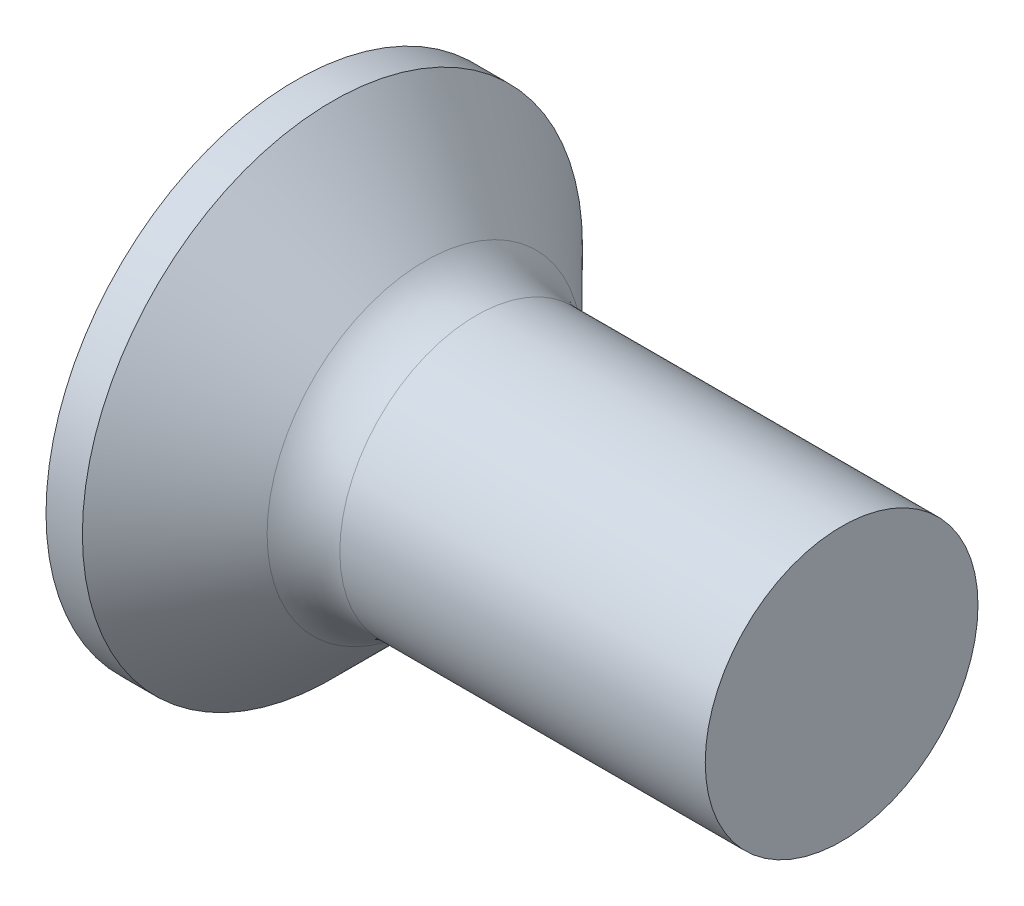
ISO-10303-21;
HEADER;
FILE_DESCRIPTION(('STEP AP214'),'2;1');
FILE_NAME('part.step','',(''),(''),'','','');
FILE_SCHEMA(('AUTOMOTIVE_DESIGN { 1 0 10303 214 1 1 1 1 }'));
ENDSEC;
DATA;
#1=APPLICATION_CONTEXT('core data for automotive mechanical design processes');
#2=APPLICATION_PROTOCOL_DEFINITION('international standard','automotive_design',2000,#1);
#3=PRODUCT_CONTEXT('',#1,'mechanical');
#4=PRODUCT('Part','Part','',(#3));
#5=PRODUCT_RELATED_PRODUCT_CATEGORY('part','',(#4));
#6=PRODUCT_DEFINITION_FORMATION('','',#4);
#7=PRODUCT_DEFINITION_CONTEXT('part definition',#1,'design');
#8=PRODUCT_DEFINITION('design','',#6,#7);
#9=PRODUCT_DEFINITION_SHAPE('','',#8);
#10=(LENGTH_UNIT() NAMED_UNIT(*) SI_UNIT(.MILLI.,.METRE.));
#11=(NAMED_UNIT(*) PLANE_ANGLE_UNIT() SI_UNIT($,.RADIAN.));
#12=(NAMED_UNIT(*) SI_UNIT($,.STERADIAN.) SOLID_ANGLE_UNIT());
#13=UNCERTAINTY_MEASURE_WITH_UNIT(LENGTH_MEASURE(1.E-05),#10,'distance_accuracy_value','');
#14=(GEOMETRIC_REPRESENTATION_CONTEXT(3) GLOBAL_UNCERTAINTY_ASSIGNED_CONTEXT((#13)) GLOBAL_UNIT_ASSIGNED_CONTEXT((#10,
#11,#12)) REPRESENTATION_CONTEXT('',''));
#15=CARTESIAN_POINT('',(0.,0.,0.));
#16=DIRECTION('',(0.,0.,1.));
#17=DIRECTION('',(1.,0.,0.));
#18=AXIS2_PLACEMENT_3D('',#15,#16,#17);
#19=CARTESIAN_POINT('',(2.01,-0.497851135403458,0.37));
#20=DIRECTION('',(0.,0.,-1.));
#21=DIRECTION('',(0.,1.,0.));
#22=AXIS2_PLACEMENT_3D('',#19,#20,#21);
#23=PLANE('',#22);
#24=DIRECTION('',(0.,-1.,0.));
#25=VECTOR('',#24,1.);
#26=CARTESIAN_POINT('',(0.,1.5,0.37));
#27=LINE('',#26,#25);
#28=CARTESIAN_POINT('',(0.,-0.590157547916263,0.37));
#29=VERTEX_POINT('',#28);
#30=CARTESIAN_POINT('',(0.,-1.5,0.37));
#31=VERTEX_POINT('',#30);
#32=EDGE_CURVE('E458',#29,#31,#27,.T.);
#33=ORIENTED_EDGE('',*,*,#32,.F.);
#34=CARTESIAN_POINT('',(-1.01053649691082,-0.672102030072118,0.37));
#35=CARTESIAN_POINT('',(-0.79970605871103,-0.655267098883947,0.37));
#36=CARTESIAN_POINT('',(-0.588886212503304,-0.638297110572311,0.37));
#37=CARTESIAN_POINT('',(-0.167272662529611,-0.603984130519828,0.37));
#38=CARTESIAN_POINT('',(0.0435210406290472,-0.586641131324258,0.37));
#39=CARTESIAN_POINT('',(0.465068838244709,-0.551479911667385,0.37));
#40=CARTESIAN_POINT('',(0.67582293271526,-0.533661691368909,0.37));
#41=CARTESIAN_POINT('',(1.09727362083221,-0.497387538872971,0.37));
#42=CARTESIAN_POINT('',(1.30797021521736,-0.478931615299089,0.37));
#43=CARTESIAN_POINT('',(1.67418894757201,-0.446067164121906,0.37));
#44=CARTESIAN_POINT('',(1.82972932585734,-0.431862501028414,0.37));
#45=CARTESIAN_POINT('',(2.14074770359484,-0.40279770973988,0.37));
#46=CARTESIAN_POINT('',(2.29622570356215,-0.38793758707517,0.37));
#47=CARTESIAN_POINT('',(2.60710169348415,-0.357305117937677,0.37));
#48=CARTESIAN_POINT('',(2.76249967840253,-0.34153271979064,0.37));
#49=CARTESIAN_POINT('',(2.99549070742189,-0.316847908281595,0.37));
#50=CARTESIAN_POINT('',(3.07313791118864,-0.308448465897182,0.37));
#51=CARTESIAN_POINT('',(3.22838341575769,-0.29120225104834,0.37));
#52=CARTESIAN_POINT('',(3.30598171599396,-0.282355473499083,0.37));
#53=CARTESIAN_POINT('',(3.38354828463398,-0.273232461289951,0.37));
#54=B_SPLINE_CURVE_WITH_KNOTS('',3,(#34,#35,#36,#37,#38,#39,#40,#41,#42,#43,#44,#45,#46,#47,#48,
#49,#50,#51,#52,#53),.UNSPECIFIED.,.F.,.F.,(4,2,2,2,2,2,2,2,2,4),(0.,0.634504777554397,
1.26902224766093,1.90353950036111,2.53804817592041,3.00661008438666,3.47516804019383,
3.94375256268972,4.17805198331268,4.41235406779909),.UNSPECIFIED.);
#55=CARTESIAN_POINT('',(2.01,-0.415013252800437,0.37));
#56=VERTEX_POINT('',#55);
#57=EDGE_CURVE('E214',#29,#56,#54,.T.);
#58=ORIENTED_EDGE('',*,*,#57,.T.);
#59=DIRECTION('',(0.,-1.,0.));
#60=VECTOR('',#59,1.);
#61=CARTESIAN_POINT('',(2.01,0.497851135403459,0.37));
#62=LINE('',#61,#60);
#63=CARTESIAN_POINT('',(2.01,-0.497851135403458,0.37));
#64=VERTEX_POINT('',#63);
#65=EDGE_CURVE('E367',#56,#64,#62,.T.);
#66=ORIENTED_EDGE('',*,*,#65,.T.);
#67=DIRECTION('',(0.894934391398442,0.446197753347436,0.));
#68=VECTOR('',#67,1.);
#69=CARTESIAN_POINT('',(0.,-1.5,0.37));
#70=LINE('',#69,#68);
#71=EDGE_CURVE('E466',#31,#64,#70,.T.);
#72=ORIENTED_EDGE('',*,*,#71,.F.);
#73=EDGE_LOOP('',(#33,#58,#66,#72));
#74=FACE_BOUND('',#73,.T.);
#75=ADVANCED_FACE('F35',(#74),#23,.T.);
#76=CARTESIAN_POINT('',(2.01,0.497851135403459,0.37));
#77=VERTEX_POINT('',#76);
#78=CARTESIAN_POINT('',(2.01,0.415013252800437,0.37));
#79=VERTEX_POINT('',#78);
#80=EDGE_CURVE('E363',#77,#79,#62,.T.);
#81=ORIENTED_EDGE('',*,*,#80,.T.);
#82=CARTESIAN_POINT('',(-1.01053649699026,0.672102030078459,0.37));
#83=CARTESIAN_POINT('',(-0.799706058781648,0.65526709888962,0.37));
#84=CARTESIAN_POINT('',(-0.588886212565099,0.638297110577309,0.37));
#85=CARTESIAN_POINT('',(-0.167272662573758,0.603984130523453,0.37));
#86=CARTESIAN_POINT('',(0.043521040593722,0.586641131327185,0.37));
#87=CARTESIAN_POINT('',(0.465068838236453,0.551479911668094,0.37));
#88=CARTESIAN_POINT('',(0.675822932725248,0.533661691368078,0.37));
#89=CARTESIAN_POINT('',(1.09727362087867,0.497387538868943,0.37));
#90=CARTESIAN_POINT('',(1.30797021528206,0.478931615293404,0.37));
#91=CARTESIAN_POINT('',(1.67418894765493,0.446067164114376,0.37));
#92=CARTESIAN_POINT('',(1.82972932594025,0.431862501020785,0.37));
#93=CARTESIAN_POINT('',(2.14074770367772,0.402797709732016,0.37));
#94=CARTESIAN_POINT('',(2.29622570364503,0.38793758706717,0.37));
#95=CARTESIAN_POINT('',(2.60710169356699,0.357305117929346,0.37));
#96=CARTESIAN_POINT('',(2.76249967848536,0.341532719782116,0.37));
#97=CARTESIAN_POINT('',(2.99549070750468,0.316847908272698,0.37));
#98=CARTESIAN_POINT('',(3.07313791127142,0.308448465888148,0.37));
#99=CARTESIAN_POINT('',(3.22838341584044,0.291202251038989,0.37));
#100=CARTESIAN_POINT('',(3.30598171607669,0.282355473489554,0.37));
#101=CARTESIAN_POINT('',(3.38354828471668,0.273232461280216,0.37));
#102=B_SPLINE_CURVE_WITH_KNOTS('',3,(#82,#83,#84,#85,#86,#87,#88,#89,#90,#91,#92,#93,#94,#95,
#96,#97,#98,#99,#100,#101),.UNSPECIFIED.,.F.,.F.,(4,2,2,2,2,2,2,2,2,4),(0.,0.634504777580945,
1.26902224771403,1.90353950046914,2.53804817608336,3.00661008454961,3.47516804035678,
3.94375256285268,4.17805198347564,4.41235406796206),.UNSPECIFIED.);
#103=CARTESIAN_POINT('',(0.,0.590157547916263,0.37));
#104=VERTEX_POINT('',#103);
#105=EDGE_CURVE('E207',#79,#104,#102,.F.);
#106=ORIENTED_EDGE('',*,*,#105,.T.);
#107=CARTESIAN_POINT('',(0.,1.5,0.37));
#108=VERTEX_POINT('',#107);
#109=EDGE_CURVE('E460',#108,#104,#27,.T.);
#110=ORIENTED_EDGE('',*,*,#109,.F.);
#111=DIRECTION('',(0.894934391398442,-0.446197753347436,0.));
#112=VECTOR('',#111,1.);
#113=CARTESIAN_POINT('',(0.,1.5,0.37));
#114=LINE('',#113,#112);
#115=EDGE_CURVE('E58',#108,#77,#114,.T.);
#116=ORIENTED_EDGE('',*,*,#115,.T.);
#117=EDGE_LOOP('',(#81,#106,#110,#116));
#118=FACE_BOUND('',#117,.T.);
#119=ADVANCED_FACE('F189',(#118),#23,.T.);
#120=CARTESIAN_POINT('',(2.01,0.497851135403458,-0.37));
#121=DIRECTION('',(0.,0.,1.));
#122=DIRECTION('',(1.,0.,0.));
#123=AXIS2_PLACEMENT_3D('',#120,#121,#122);
#124=PLANE('',#123);
#125=DIRECTION('',(0.,1.,0.));
#126=VECTOR('',#125,1.);
#127=CARTESIAN_POINT('',(2.01,-0.497851135403458,-0.37));
#128=LINE('',#127,#126);
#129=CARTESIAN_POINT('',(2.01,-0.497851135403458,-0.37));
#130=VERTEX_POINT('',#129);
#131=CARTESIAN_POINT('',(2.01,-0.415013252800437,-0.37));
#132=VERTEX_POINT('',#131);
#133=EDGE_CURVE('E376',#130,#132,#128,.T.);
#134=ORIENTED_EDGE('',*,*,#133,.T.);
#135=CARTESIAN_POINT('',(-1.01053649691082,-0.672102030072118,-0.37));
#136=CARTESIAN_POINT('',(-0.79970605871103,-0.655267098883947,-0.37));
#137=CARTESIAN_POINT('',(-0.588886212503305,-0.638297110572311,-0.37));
#138=CARTESIAN_POINT('',(-0.16727266252961,-0.603984130519828,-0.37));
#139=CARTESIAN_POINT('',(0.0435210406290472,-0.586641131324259,-0.37));
#140=CARTESIAN_POINT('',(0.465068838244709,-0.551479911667385,-0.37));
#141=CARTESIAN_POINT('',(0.67582293271526,-0.533661691368909,-0.37));
#142=CARTESIAN_POINT('',(1.09727362083221,-0.497387538872971,-0.37));
#143=CARTESIAN_POINT('',(1.30797021521736,-0.47893161529909,-0.37));
#144=CARTESIAN_POINT('',(1.67418894757201,-0.446067164121906,-0.37));
#145=CARTESIAN_POINT('',(1.82972932585734,-0.431862501028414,-0.37));
#146=CARTESIAN_POINT('',(2.14074770359484,-0.40279770973988,-0.37));
#147=CARTESIAN_POINT('',(2.29622570356215,-0.38793758707517,-0.37));
#148=CARTESIAN_POINT('',(2.60710169348415,-0.357305117937677,-0.37));
#149=CARTESIAN_POINT('',(2.76249967840254,-0.34153271979064,-0.37));
#150=CARTESIAN_POINT('',(2.99549070742189,-0.316847908281595,-0.37));
#151=CARTESIAN_POINT('',(3.07313791118864,-0.308448465897182,-0.37));
#152=CARTESIAN_POINT('',(3.22838341575769,-0.29120225104834,-0.37));
#153=CARTESIAN_POINT('',(3.30598171599396,-0.282355473499083,-0.37));
#154=CARTESIAN_POINT('',(3.38354828463398,-0.273232461289951,-0.37));
#155=B_SPLINE_CURVE_WITH_KNOTS('',3,(#135,#136,#137,#138,#139,#140,#141,#142,#143,#144,#145,
#146,#147,#148,#149,#150,#151,#152,#153,#154),.UNSPECIFIED.,.F.,.F.,(4,2,2,2,2,2,2,2,2,4),(0.,
0.634504777554397,1.26902224766093,1.90353950036111,2.53804817592041,3.00661008438666,
3.47516804019383,3.94375256268973,4.17805198331268,4.41235406779909),.UNSPECIFIED.);
#156=CARTESIAN_POINT('',(0.,-0.590157547916263,-0.37));
#157=VERTEX_POINT('',#156);
#158=EDGE_CURVE('E270',#132,#157,#155,.F.);
#159=ORIENTED_EDGE('',*,*,#158,.T.);
#160=DIRECTION('',(0.,1.,0.));
#161=VECTOR('',#160,1.);
#162=CARTESIAN_POINT('',(0.,-1.5,-0.37));
#163=LINE('',#162,#161);
#164=CARTESIAN_POINT('',(0.,-1.5,-0.37));
#165=VERTEX_POINT('',#164);
#166=EDGE_CURVE('E459',#165,#157,#163,.T.);
#167=ORIENTED_EDGE('',*,*,#166,.F.);
#168=DIRECTION('',(0.894934391398442,0.446197753347436,0.));
#169=VECTOR('',#168,1.);
#170=CARTESIAN_POINT('',(0.,-1.5,-0.37));
#171=LINE('',#170,#169);
#172=EDGE_CURVE('E469',#165,#130,#171,.T.);
#173=ORIENTED_EDGE('',*,*,#172,.T.);
#174=EDGE_LOOP('',(#134,#159,#167,#173));
#175=FACE_BOUND('',#174,.T.);
#176=ADVANCED_FACE('F195',(#175),#124,.T.);
#177=CARTESIAN_POINT('',(0.,0.590157547916263,-0.37));
#178=VERTEX_POINT('',#177);
#179=CARTESIAN_POINT('',(0.,1.5,-0.37));
#180=VERTEX_POINT('',#179);
#181=EDGE_CURVE('E465',#178,#180,#163,.T.);
#182=ORIENTED_EDGE('',*,*,#181,.F.);
#183=CARTESIAN_POINT('',(-1.01053649691082,0.672102030072118,-0.37));
#184=CARTESIAN_POINT('',(-0.79970605871103,0.655267098883947,-0.37));
#185=CARTESIAN_POINT('',(-0.588886212503304,0.638297110572311,-0.37));
#186=CARTESIAN_POINT('',(-0.16727266252961,0.603984130519828,-0.37));
#187=CARTESIAN_POINT('',(0.0435210406290473,0.586641131324259,-0.37));
#188=CARTESIAN_POINT('',(0.465068838244709,0.551479911667385,-0.37));
#189=CARTESIAN_POINT('',(0.67582293271526,0.533661691368909,-0.37));
#190=CARTESIAN_POINT('',(1.09727362083221,0.497387538872971,-0.37));
#191=CARTESIAN_POINT('',(1.30797021521736,0.478931615299089,-0.37));
#192=CARTESIAN_POINT('',(1.67418894757201,0.446067164121906,-0.37));
#193=CARTESIAN_POINT('',(1.82972932585734,0.431862501028415,-0.37));
#194=CARTESIAN_POINT('',(2.14074770359484,0.40279770973988,-0.37));
#195=CARTESIAN_POINT('',(2.29622570356215,0.38793758707517,-0.37));
#196=CARTESIAN_POINT('',(2.60710169348415,0.357305117937677,-0.37));
#197=CARTESIAN_POINT('',(2.76249967840253,0.34153271979064,-0.37));
#198=CARTESIAN_POINT('',(2.99549070742189,0.316847908281595,-0.37));
#199=CARTESIAN_POINT('',(3.07313791118864,0.308448465897183,-0.37));
#200=CARTESIAN_POINT('',(3.22838341575769,0.29120225104834,-0.37));
#201=CARTESIAN_POINT('',(3.30598171599396,0.282355473499083,-0.37));
#202=CARTESIAN_POINT('',(3.38354828463398,0.273232461289951,-0.37));
#203=B_SPLINE_CURVE_WITH_KNOTS('',3,(#183,#184,#185,#186,#187,#188,#189,#190,#191,#192,#193,
#194,#195,#196,#197,#198,#199,#200,#201,#202),.UNSPECIFIED.,.F.,.F.,(4,2,2,2,2,2,2,2,2,4),(0.,
0.634504777554397,1.26902224766093,1.90353950036111,2.53804817592041,3.00661008438666,
3.47516804019383,3.94375256268972,4.17805198331267,4.41235406779909),.UNSPECIFIED.);
#204=CARTESIAN_POINT('',(2.01,0.415013252800437,-0.37));
#205=VERTEX_POINT('',#204);
#206=EDGE_CURVE('E264',#178,#205,#203,.T.);
#207=ORIENTED_EDGE('',*,*,#206,.T.);
#208=CARTESIAN_POINT('',(2.01,0.497851135403459,-0.37));
#209=VERTEX_POINT('',#208);
#210=EDGE_CURVE('E378',#205,#209,#128,.T.);
#211=ORIENTED_EDGE('',*,*,#210,.T.);
#212=DIRECTION('',(0.894934391398442,-0.446197753347436,0.));
#213=VECTOR('',#212,1.);
#214=CARTESIAN_POINT('',(0.,1.5,-0.37));
#215=LINE('',#214,#213);
#216=EDGE_CURVE('E375',#180,#209,#215,.T.);
#217=ORIENTED_EDGE('',*,*,#216,.F.);
#218=EDGE_LOOP('',(#182,#207,#211,#217));
#219=FACE_BOUND('',#218,.T.);
#220=ADVANCED_FACE('F476',(#219),#124,.T.);
#221=CARTESIAN_POINT('',(2.01,0.497851135403459,-0.37));
#222=DIRECTION('',(1.,0.,0.));
#223=DIRECTION('',(0.,0.,-1.));
#224=AXIS2_PLACEMENT_3D('',#221,#222,#223);
#225=PLANE('',#224);
#226=CARTESIAN_POINT('',(2.01,0.,0.));
#227=DIRECTION('',(-1.,0.,0.));
#228=DIRECTION('',(0.,0.,1.));
#229=AXIS2_PLACEMENT_3D('',#226,#227,#228);
#230=CIRCLE('',#229,0.555999999999999);
#231=CARTESIAN_POINT('',(2.01,-0.24754847399547,-0.497851135403459));
#232=VERTEX_POINT('',#231);
#233=CARTESIAN_POINT('',(2.01,-0.369999999999999,-0.415013252800438));
#234=VERTEX_POINT('',#233);
#235=EDGE_CURVE('E342',#232,#234,#230,.T.);
#236=ORIENTED_EDGE('',*,*,#235,.F.);
#237=DIRECTION('',(0.,1.,0.));
#238=VECTOR('',#237,1.);
#239=CARTESIAN_POINT('',(2.01,-0.369999999999998,-0.49785113540346));
#240=LINE('',#239,#238);
#241=CARTESIAN_POINT('',(2.01,-0.369999999999998,-0.49785113540346));
#242=VERTEX_POINT('',#241);
#243=EDGE_CURVE('E443',#242,#232,#240,.T.);
#244=ORIENTED_EDGE('',*,*,#243,.F.);
#245=DIRECTION('',(0.,0.,-1.));
#246=VECTOR('',#245,1.);
#247=CARTESIAN_POINT('',(2.01,-0.370000000000002,0.497851135403457));
#248=LINE('',#247,#246);
#249=EDGE_CURVE('E447',#234,#242,#248,.T.);
#250=ORIENTED_EDGE('',*,*,#249,.F.);
#251=EDGE_LOOP('',(#236,#244,#250));
#252=FACE_BOUND('',#251,.T.);
#253=ADVANCED_FACE('F489',(#252),#225,.F.);
#254=CARTESIAN_POINT('',(2.01,-0.497851135403458,-0.247548473995472));
#255=VERTEX_POINT('',#254);
#256=EDGE_CURVE('E337',#132,#255,#230,.T.);
#257=ORIENTED_EDGE('',*,*,#256,.F.);
#258=ORIENTED_EDGE('',*,*,#133,.F.);
#259=DIRECTION('',(0.,0.,-1.));
#260=VECTOR('',#259,1.);
#261=CARTESIAN_POINT('',(2.01,-0.497851135403458,0.37));
#262=LINE('',#261,#260);
#263=EDGE_CURVE('E366',#255,#130,#262,.T.);
#264=ORIENTED_EDGE('',*,*,#263,.F.);
#265=EDGE_LOOP('',(#257,#258,#264));
#266=FACE_BOUND('',#265,.T.);
#267=ADVANCED_FACE('F495',(#266),#225,.F.);
#268=CARTESIAN_POINT('',(2.01,-0.497851135403458,0.247548473995472));
#269=VERTEX_POINT('',#268);
#270=EDGE_CURVE('E332',#269,#56,#230,.T.);
#271=ORIENTED_EDGE('',*,*,#270,.F.);
#272=EDGE_CURVE('E369',#64,#269,#262,.T.);
#273=ORIENTED_EDGE('',*,*,#272,.F.);
#274=ORIENTED_EDGE('',*,*,#65,.F.);
#275=EDGE_LOOP('',(#271,#273,#274));
#276=FACE_BOUND('',#275,.T.);
#277=ADVANCED_FACE('F501',(#276),#225,.F.);
#278=CARTESIAN_POINT('',(2.01,-0.370000000000001,0.415013252800436));
#279=VERTEX_POINT('',#278);
#280=CARTESIAN_POINT('',(2.01,-0.247548473995473,0.497851135403458));
#281=VERTEX_POINT('',#280);
#282=EDGE_CURVE('E50',#279,#281,#230,.T.);
#283=ORIENTED_EDGE('',*,*,#282,.F.);
#284=CARTESIAN_POINT('',(2.01,-0.370000000000002,0.497851135403457));
#285=VERTEX_POINT('',#284);
#286=EDGE_CURVE('E449',#285,#279,#248,.T.);
#287=ORIENTED_EDGE('',*,*,#286,.F.);
#288=DIRECTION('',(0.,-1.,0.));
#289=VECTOR('',#288,1.);
#290=CARTESIAN_POINT('',(2.01,0.369999999999998,0.49785113540346));
#291=LINE('',#290,#289);
#292=EDGE_CURVE('E448',#281,#285,#291,.T.);
#293=ORIENTED_EDGE('',*,*,#292,.F.);
#294=EDGE_LOOP('',(#283,#287,#293));
#295=FACE_BOUND('',#294,.T.);
#296=ADVANCED_FACE('F528',(#295),#225,.F.);
#297=CARTESIAN_POINT('',(2.01,0.24754847399547,0.497851135403459));
#298=VERTEX_POINT('',#297);
#299=CARTESIAN_POINT('',(2.01,0.369999999999999,0.415013252800438));
#300=VERTEX_POINT('',#299);
#301=EDGE_CURVE('E323',#298,#300,#230,.T.);
#302=ORIENTED_EDGE('',*,*,#301,.F.);
#303=CARTESIAN_POINT('',(2.01,0.369999999999998,0.49785113540346));
#304=VERTEX_POINT('',#303);
#305=EDGE_CURVE('E444',#304,#298,#291,.T.);
#306=ORIENTED_EDGE('',*,*,#305,.F.);
#307=DIRECTION('',(0.,0.,1.));
#308=VECTOR('',#307,1.);
#309=CARTESIAN_POINT('',(2.01,0.370000000000002,-0.497851135403457));
#310=LINE('',#309,#308);
#311=EDGE_CURVE('E221',#300,#304,#310,.T.);
#312=ORIENTED_EDGE('',*,*,#311,.F.);
#313=EDGE_LOOP('',(#302,#306,#312));
#314=FACE_BOUND('',#313,.T.);
#315=ADVANCED_FACE('F485',(#314),#225,.F.);
#316=CARTESIAN_POINT('',(2.01,0.497851135403459,0.247548473995472));
#317=VERTEX_POINT('',#316);
#318=EDGE_CURVE('E330',#79,#317,#230,.T.);
#319=ORIENTED_EDGE('',*,*,#318,.F.);
#320=ORIENTED_EDGE('',*,*,#80,.F.);
#321=DIRECTION('',(0.,0.,1.));
#322=VECTOR('',#321,1.);
#323=CARTESIAN_POINT('',(2.01,0.497851135403459,-0.37));
#324=LINE('',#323,#322);
#325=EDGE_CURVE('E364',#317,#77,#324,.T.);
#326=ORIENTED_EDGE('',*,*,#325,.F.);
#327=EDGE_LOOP('',(#319,#320,#326));
#328=FACE_BOUND('',#327,.T.);
#329=ADVANCED_FACE('F362',(#328),#225,.F.);
#330=CARTESIAN_POINT('',(2.01,0.497851135403459,-0.247548473995472));
#331=VERTEX_POINT('',#330);
#332=EDGE_CURVE('E352',#331,#205,#230,.T.);
#333=ORIENTED_EDGE('',*,*,#332,.F.);
#334=EDGE_CURVE('E371',#209,#331,#324,.T.);
#335=ORIENTED_EDGE('',*,*,#334,.F.);
#336=ORIENTED_EDGE('',*,*,#210,.F.);
#337=EDGE_LOOP('',(#333,#335,#336));
#338=FACE_BOUND('',#337,.T.);
#339=ADVANCED_FACE('F478',(#338),#225,.F.);
#340=CARTESIAN_POINT('',(2.01,-0.497851135403458,-0.37));
#341=DIRECTION('',(-0.446197753347436,0.894934391398443,0.));
#342=DIRECTION('',(-0.894934391398442,-0.446197753347436,0.));
#343=AXIS2_PLACEMENT_3D('',#340,#341,#342);
#344=PLANE('',#343);
#345=ORIENTED_EDGE('',*,*,#272,.T.);
#346=CARTESIAN_POINT('',(2.86902919914418,-0.0695550475538963,0.));
#347=DIRECTION('',(-0.446197753347436,0.894934391398443,0.));
#348=DIRECTION('',(-0.894934391398443,-0.446197753347436,0.));
#349=AXIS2_PLACEMENT_3D('',#346,#347,#348);
#350=ELLIPSE('',#349,1.11145971268776,0.491029001453358);
#351=EDGE_CURVE('E282',#269,#255,#350,.F.);
#352=ORIENTED_EDGE('',*,*,#351,.T.);
#353=ORIENTED_EDGE('',*,*,#263,.T.);
#354=ORIENTED_EDGE('',*,*,#172,.F.);
#355=DIRECTION('',(0.,0.,-1.));
#356=VECTOR('',#355,1.);
#357=CARTESIAN_POINT('',(0.,-1.5,0.37));
#358=LINE('',#357,#356);
#359=EDGE_CURVE('E383',#31,#165,#358,.T.);
#360=ORIENTED_EDGE('',*,*,#359,.F.);
#361=ORIENTED_EDGE('',*,*,#71,.T.);
#362=EDGE_LOOP('',(#345,#352,#353,#354,#360,#361));
#363=FACE_BOUND('',#362,.T.);
#364=ADVANCED_FACE('F201',(#363),#344,.T.);
#365=CARTESIAN_POINT('',(2.01,0.497851135403459,0.37));
#366=DIRECTION('',(-0.446197753347436,-0.894934391398443,0.));
#367=DIRECTION('',(0.894934391398442,-0.446197753347436,0.));
#368=AXIS2_PLACEMENT_3D('',#365,#366,#367);
#369=PLANE('',#368);
#370=ORIENTED_EDGE('',*,*,#334,.T.);
#371=CARTESIAN_POINT('',(2.86902919914418,0.0695550475538964,0.));
#372=DIRECTION('',(-0.446197753347436,-0.894934391398443,0.));
#373=DIRECTION('',(-0.894934391398443,0.446197753347436,0.));
#374=AXIS2_PLACEMENT_3D('',#371,#372,#373);
#375=ELLIPSE('',#374,1.11145971268776,0.491029001453358);
#376=EDGE_CURVE('E287',#331,#317,#375,.F.);
#377=ORIENTED_EDGE('',*,*,#376,.T.);
#378=ORIENTED_EDGE('',*,*,#325,.T.);
#379=ORIENTED_EDGE('',*,*,#115,.F.);
#380=DIRECTION('',(0.,0.,1.));
#381=VECTOR('',#380,1.);
#382=CARTESIAN_POINT('',(0.,1.5,-0.37));
#383=LINE('',#382,#381);
#384=EDGE_CURVE('E455',#180,#108,#383,.T.);
#385=ORIENTED_EDGE('',*,*,#384,.F.);
#386=ORIENTED_EDGE('',*,*,#216,.T.);
#387=EDGE_LOOP('',(#370,#377,#378,#379,#385,#386));
#388=FACE_BOUND('',#387,.T.);
#389=ADVANCED_FACE('F474',(#388),#369,.T.);
#390=CARTESIAN_POINT('',(2.01,0.369999999999998,0.497851135403459));
#391=DIRECTION('',(0.,-1.,0.));
#392=DIRECTION('',(1.,0.,0.));
#393=AXIS2_PLACEMENT_3D('',#390,#391,#392);
#394=PLANE('',#393);
#395=CARTESIAN_POINT('',(2.01,0.370000000000002,-0.497851135403457));
#396=VERTEX_POINT('',#395);
#397=CARTESIAN_POINT('',(2.01,0.370000000000001,-0.415013252800436));
#398=VERTEX_POINT('',#397);
#399=EDGE_CURVE('E453',#396,#398,#310,.T.);
#400=ORIENTED_EDGE('',*,*,#399,.T.);
#401=CARTESIAN_POINT('',(-1.01053649699026,0.370000000000002,-0.672102030078458));
#402=CARTESIAN_POINT('',(-0.799706058781648,0.370000000000002,-0.655267098889619));
#403=CARTESIAN_POINT('',(-0.588886212565099,0.370000000000002,-0.638297110577308));
#404=CARTESIAN_POINT('',(-0.167272662573758,0.370000000000002,-0.603984130523452));
#405=CARTESIAN_POINT('',(0.0435210405937218,0.370000000000002,-0.586641131327184));
#406=CARTESIAN_POINT('',(0.465068838236452,0.370000000000002,-0.551479911668093));
#407=CARTESIAN_POINT('',(0.675822932725247,0.370000000000002,-0.533661691368077));
#408=CARTESIAN_POINT('',(1.09727362087867,0.370000000000002,-0.497387538868942));
#409=CARTESIAN_POINT('',(1.30797021528206,0.370000000000002,-0.478931615293403));
#410=CARTESIAN_POINT('',(1.67418894765493,0.370000000000001,-0.446067164114375));
#411=CARTESIAN_POINT('',(1.82972932594025,0.370000000000001,-0.431862501020784));
#412=CARTESIAN_POINT('',(2.14074770367772,0.370000000000001,-0.402797709732014));
#413=CARTESIAN_POINT('',(2.29622570364503,0.370000000000001,-0.387937587067169));
#414=CARTESIAN_POINT('',(2.60710169356699,0.370000000000001,-0.357305117929345));
#415=CARTESIAN_POINT('',(2.76249967848536,0.370000000000001,-0.341532719782114));
#416=CARTESIAN_POINT('',(2.99549070750468,0.370000000000001,-0.316847908272697));
#417=CARTESIAN_POINT('',(3.07313791127142,0.370000000000001,-0.308448465888147));
#418=CARTESIAN_POINT('',(3.22838341584044,0.370000000000001,-0.291202251038988));
#419=CARTESIAN_POINT('',(3.30598171607669,0.370000000000001,-0.282355473489552));
#420=CARTESIAN_POINT('',(3.38354828471668,0.370000000000001,-0.273232461280215));
#421=B_SPLINE_CURVE_WITH_KNOTS('',3,(#401,#402,#403,#404,#405,#406,#407,#408,#409,#410,#411,
#412,#413,#414,#415,#416,#417,#418,#419,#420),.UNSPECIFIED.,.F.,.F.,(4,2,2,2,2,2,2,2,2,4),(0.,
0.634504777580945,1.26902224771403,1.90353950046914,2.53804817608336,3.00661008454961,
3.47516804035678,3.94375256285268,4.17805198347564,4.41235406796206),.UNSPECIFIED.);
#422=CARTESIAN_POINT('',(0.,0.370000000000002,-0.590157547916262));
#423=VERTEX_POINT('',#422);
#424=EDGE_CURVE('E256',#398,#423,#421,.F.);
#425=ORIENTED_EDGE('',*,*,#424,.T.);
#426=DIRECTION('',(0.,0.,1.));
#427=VECTOR('',#426,1.);
#428=CARTESIAN_POINT('',(0.,0.370000000000005,-1.5));
#429=LINE('',#428,#427);
#430=CARTESIAN_POINT('',(0.,0.370000000000005,-1.5));
#431=VERTEX_POINT('',#430);
#432=EDGE_CURVE('E429',#431,#423,#429,.T.);
#433=ORIENTED_EDGE('',*,*,#432,.F.);
#434=DIRECTION('',(0.894934391398442,0.,0.446197753347436));
#435=VECTOR('',#434,1.);
#436=CARTESIAN_POINT('',(0.,0.370000000000005,-1.5));
#437=LINE('',#436,#435);
#438=EDGE_CURVE('E435',#431,#396,#437,.T.);
#439=ORIENTED_EDGE('',*,*,#438,.T.);
#440=EDGE_LOOP('',(#400,#425,#433,#439));
#441=FACE_BOUND('',#440,.T.);
#442=ADVANCED_FACE('F608',(#441),#394,.T.);
#443=CARTESIAN_POINT('',(2.01,-0.369999999999998,-0.497851135403459));
#444=DIRECTION('',(0.,1.,0.));
#445=DIRECTION('',(0.,0.,1.));
#446=AXIS2_PLACEMENT_3D('',#443,#444,#445);
#447=PLANE('',#446);
#448=DIRECTION('',(0.,0.,-1.));
#449=VECTOR('',#448,1.);
#450=CARTESIAN_POINT('',(0.,-0.370000000000005,1.5));
#451=LINE('',#450,#449);
#452=CARTESIAN_POINT('',(0.,-0.369999999999998,-0.590157547916264));
#453=VERTEX_POINT('',#452);
#454=CARTESIAN_POINT('',(0.,-0.369999999999995,-1.5));
#455=VERTEX_POINT('',#454);
#456=EDGE_CURVE('E425',#453,#455,#451,.T.);
#457=ORIENTED_EDGE('',*,*,#456,.F.);
#458=CARTESIAN_POINT('',(-1.01053649699026,-0.369999999999998,-0.67210203007846));
#459=CARTESIAN_POINT('',(-0.799706058781648,-0.369999999999998,-0.655267098889622));
#460=CARTESIAN_POINT('',(-0.588886212565099,-0.369999999999998,-0.638297110577311));
#461=CARTESIAN_POINT('',(-0.167272662573759,-0.369999999999998,-0.603984130523454));
#462=CARTESIAN_POINT('',(0.0435210405937218,-0.369999999999998,-0.586641131327186));
#463=CARTESIAN_POINT('',(0.465068838236453,-0.369999999999998,-0.551479911668095));
#464=CARTESIAN_POINT('',(0.675822932725248,-0.369999999999998,-0.53366169136808));
#465=CARTESIAN_POINT('',(1.09727362087867,-0.369999999999998,-0.497387538868944));
#466=CARTESIAN_POINT('',(1.30797021528206,-0.369999999999998,-0.478931615293405));
#467=CARTESIAN_POINT('',(1.67418894765493,-0.369999999999999,-0.446067164114377));
#468=CARTESIAN_POINT('',(1.82972932594025,-0.369999999999999,-0.431862501020786));
#469=CARTESIAN_POINT('',(2.14074770367772,-0.369999999999999,-0.402797709732017));
#470=CARTESIAN_POINT('',(2.29622570364503,-0.369999999999999,-0.387937587067171));
#471=CARTESIAN_POINT('',(2.60710169356699,-0.369999999999999,-0.357305117929348));
#472=CARTESIAN_POINT('',(2.76249967848536,-0.369999999999999,-0.341532719782117));
#473=CARTESIAN_POINT('',(2.99549070750468,-0.369999999999999,-0.316847908272699));
#474=CARTESIAN_POINT('',(3.07313791127142,-0.369999999999999,-0.30844846588815));
#475=CARTESIAN_POINT('',(3.22838341584044,-0.369999999999999,-0.291202251038991));
#476=CARTESIAN_POINT('',(3.30598171607669,-0.369999999999999,-0.282355473489555));
#477=CARTESIAN_POINT('',(3.38354828471668,-0.369999999999999,-0.273232461280217));
#478=B_SPLINE_CURVE_WITH_KNOTS('',3,(#458,#459,#460,#461,#462,#463,#464,#465,#466,#467,#468,
#469,#470,#471,#472,#473,#474,#475,#476,#477),.UNSPECIFIED.,.F.,.F.,(4,2,2,2,2,2,2,2,2,4),(0.,
0.634504777580943,1.26902224771403,1.90353950046914,2.53804817608336,3.00661008454961,
3.47516804035678,3.94375256285268,4.17805198347564,4.41235406796206),.UNSPECIFIED.);
#479=EDGE_CURVE('E249',#453,#234,#478,.T.);
#480=ORIENTED_EDGE('',*,*,#479,.T.);
#481=ORIENTED_EDGE('',*,*,#249,.T.);
#482=DIRECTION('',(0.894934391398442,0.,0.446197753347436));
#483=VECTOR('',#482,1.);
#484=CARTESIAN_POINT('',(0.,-0.369999999999995,-1.5));
#485=LINE('',#484,#483);
#486=EDGE_CURVE('E432',#455,#242,#485,.T.);
#487=ORIENTED_EDGE('',*,*,#486,.F.);
#488=EDGE_LOOP('',(#457,#480,#481,#487));
#489=FACE_BOUND('',#488,.T.);
#490=ADVANCED_FACE('F506',(#489),#447,.T.);
#491=CARTESIAN_POINT('',(2.01,0.370000000000002,-0.497851135403457));
#492=DIRECTION('',(-0.446197753347436,0.,0.894934391398443));
#493=DIRECTION('',(-0.894934391398442,0.,-0.446197753347436));
#494=AXIS2_PLACEMENT_3D('',#491,#492,#493);
#495=PLANE('',#494);
#496=ORIENTED_EDGE('',*,*,#243,.T.);
#497=CARTESIAN_POINT('',(2.86902919914418,0.,-0.0695550475538964));
#498=DIRECTION('',(-0.446197753347436,0.,0.894934391398443));
#499=DIRECTION('',(-0.894934391398443,0.,-0.446197753347436));
#500=AXIS2_PLACEMENT_3D('',#497,#498,#499);
#501=ELLIPSE('',#500,1.11145971268776,0.491029001453358);
#502=CARTESIAN_POINT('',(2.01,0.247548473995474,-0.497851135403457));
#503=VERTEX_POINT('',#502);
#504=EDGE_CURVE('E300',#232,#503,#501,.F.);
#505=ORIENTED_EDGE('',*,*,#504,.T.);
#506=EDGE_CURVE('E451',#503,#396,#240,.T.);
#507=ORIENTED_EDGE('',*,*,#506,.T.);
#508=ORIENTED_EDGE('',*,*,#438,.F.);
#509=DIRECTION('',(0.,1.,0.));
#510=VECTOR('',#509,1.);
#511=CARTESIAN_POINT('',(0.,-0.369999999999995,-1.5));
#512=LINE('',#511,#510);
#513=EDGE_CURVE('E424',#455,#431,#512,.T.);
#514=ORIENTED_EDGE('',*,*,#513,.F.);
#515=ORIENTED_EDGE('',*,*,#486,.T.);
#516=EDGE_LOOP('',(#496,#505,#507,#508,#514,#515));
#517=FACE_BOUND('',#516,.T.);
#518=ADVANCED_FACE('F226',(#517),#495,.T.);
#519=ORIENTED_EDGE('',*,*,#286,.T.);
#520=CARTESIAN_POINT('',(-1.01053649699026,-0.370000000000002,0.672102030078458));
#521=CARTESIAN_POINT('',(-0.799706058781648,-0.370000000000002,0.655267098889619));
#522=CARTESIAN_POINT('',(-0.588886212565099,-0.370000000000002,0.638297110577308));
#523=CARTESIAN_POINT('',(-0.167272662573758,-0.370000000000002,0.603984130523451));
#524=CARTESIAN_POINT('',(0.0435210405937218,-0.370000000000002,0.586641131327183));
#525=CARTESIAN_POINT('',(0.465068838236452,-0.370000000000002,0.551479911668093));
#526=CARTESIAN_POINT('',(0.675822932725247,-0.370000000000002,0.533661691368077));
#527=CARTESIAN_POINT('',(1.09727362087867,-0.370000000000002,0.497387538868942));
#528=CARTESIAN_POINT('',(1.30797021528206,-0.370000000000002,0.478931615293403));
#529=CARTESIAN_POINT('',(1.67418894765493,-0.370000000000002,0.446067164114375));
#530=CARTESIAN_POINT('',(1.82972932594025,-0.370000000000001,0.431862501020784));
#531=CARTESIAN_POINT('',(2.14074770367772,-0.370000000000001,0.402797709732014));
#532=CARTESIAN_POINT('',(2.29622570364503,-0.370000000000001,0.387937587067169));
#533=CARTESIAN_POINT('',(2.60710169356699,-0.370000000000001,0.357305117929345));
#534=CARTESIAN_POINT('',(2.76249967848536,-0.370000000000001,0.341532719782114));
#535=CARTESIAN_POINT('',(2.99549070750468,-0.370000000000001,0.316847908272697));
#536=CARTESIAN_POINT('',(3.07313791127142,-0.370000000000001,0.308448465888147));
#537=CARTESIAN_POINT('',(3.22838341584044,-0.370000000000001,0.291202251038988));
#538=CARTESIAN_POINT('',(3.30598171607669,-0.370000000000001,0.282355473489552));
#539=CARTESIAN_POINT('',(3.38354828471668,-0.370000000000001,0.273232461280214));
#540=B_SPLINE_CURVE_WITH_KNOTS('',3,(#520,#521,#522,#523,#524,#525,#526,#527,#528,#529,#530,
#531,#532,#533,#534,#535,#536,#537,#538,#539),.UNSPECIFIED.,.F.,.F.,(4,2,2,2,2,2,2,2,2,4),(0.,
0.634504777580945,1.26902224771403,1.90353950046914,2.53804817608336,3.00661008454961,
3.47516804035678,3.94375256285268,4.17805198347564,4.41235406796206),.UNSPECIFIED.);
#541=CARTESIAN_POINT('',(0.,-0.370000000000002,0.590157547916262));
#542=VERTEX_POINT('',#541);
#543=EDGE_CURVE('E241',#279,#542,#540,.F.);
#544=ORIENTED_EDGE('',*,*,#543,.T.);
#545=CARTESIAN_POINT('',(0.,-0.370000000000005,1.5));
#546=VERTEX_POINT('',#545);
#547=EDGE_CURVE('E420',#546,#542,#451,.T.);
#548=ORIENTED_EDGE('',*,*,#547,.F.);
#549=DIRECTION('',(0.894934391398442,0.,-0.446197753347436));
#550=VECTOR('',#549,1.);
#551=CARTESIAN_POINT('',(0.,-0.370000000000005,1.5));
#552=LINE('',#551,#550);
#553=EDGE_CURVE('E438',#546,#285,#552,.T.);
#554=ORIENTED_EDGE('',*,*,#553,.T.);
#555=EDGE_LOOP('',(#519,#544,#548,#554));
#556=FACE_BOUND('',#555,.T.);
#557=ADVANCED_FACE('F526',(#556),#447,.T.);
#558=CARTESIAN_POINT('',(0.,0.369999999999998,0.590157547916264));
#559=VERTEX_POINT('',#558);
#560=CARTESIAN_POINT('',(0.,0.369999999999995,1.5));
#561=VERTEX_POINT('',#560);
#562=EDGE_CURVE('E431',#559,#561,#429,.T.);
#563=ORIENTED_EDGE('',*,*,#562,.F.);
#564=CARTESIAN_POINT('',(-1.01053649699026,0.369999999999997,0.67210203007846));
#565=CARTESIAN_POINT('',(-0.799706058781648,0.369999999999998,0.655267098889622));
#566=CARTESIAN_POINT('',(-0.588886212565098,0.369999999999998,0.638297110577311));
#567=CARTESIAN_POINT('',(-0.167272662573758,0.369999999999998,0.603984130523454));
#568=CARTESIAN_POINT('',(0.0435210405937221,0.369999999999998,0.586641131327186));
#569=CARTESIAN_POINT('',(0.465068838236453,0.369999999999998,0.551479911668096));
#570=CARTESIAN_POINT('',(0.675822932725248,0.369999999999998,0.53366169136808));
#571=CARTESIAN_POINT('',(1.09727362087867,0.369999999999998,0.497387538868944));
#572=CARTESIAN_POINT('',(1.30797021528206,0.369999999999998,0.478931615293405));
#573=CARTESIAN_POINT('',(1.67418894765493,0.369999999999998,0.446067164114377));
#574=CARTESIAN_POINT('',(1.82972932594025,0.369999999999998,0.431862501020787));
#575=CARTESIAN_POINT('',(2.14074770367772,0.369999999999999,0.402797709732017));
#576=CARTESIAN_POINT('',(2.29622570364503,0.369999999999999,0.387937587067172));
#577=CARTESIAN_POINT('',(2.60710169356699,0.369999999999999,0.357305117929348));
#578=CARTESIAN_POINT('',(2.76249967848536,0.369999999999999,0.341532719782117));
#579=CARTESIAN_POINT('',(2.99549070750468,0.369999999999999,0.3168479082727));
#580=CARTESIAN_POINT('',(3.07313791127142,0.369999999999999,0.30844846588815));
#581=CARTESIAN_POINT('',(3.22838341584044,0.369999999999999,0.291202251038991));
#582=CARTESIAN_POINT('',(3.30598171607669,0.369999999999999,0.282355473489555));
#583=CARTESIAN_POINT('',(3.38354828471668,0.369999999999999,0.273232461280217));
#584=B_SPLINE_CURVE_WITH_KNOTS('',3,(#564,#565,#566,#567,#568,#569,#570,#571,#572,#573,#574,
#575,#576,#577,#578,#579,#580,#581,#582,#583),.UNSPECIFIED.,.F.,.F.,(4,2,2,2,2,2,2,2,2,4),(0.,
0.634504777580945,1.26902224771403,1.90353950046914,2.53804817608336,3.00661008454961,
3.47516804035678,3.94375256285268,4.17805198347564,4.41235406796206),.UNSPECIFIED.);
#585=EDGE_CURVE('E231',#559,#300,#584,.T.);
#586=ORIENTED_EDGE('',*,*,#585,.T.);
#587=ORIENTED_EDGE('',*,*,#311,.T.);
#588=DIRECTION('',(0.894934391398442,0.,-0.446197753347436));
#589=VECTOR('',#588,1.);
#590=CARTESIAN_POINT('',(0.,0.369999999999995,1.5));
#591=LINE('',#590,#589);
#592=EDGE_CURVE('E440',#561,#304,#591,.T.);
#593=ORIENTED_EDGE('',*,*,#592,.F.);
#594=EDGE_LOOP('',(#563,#586,#587,#593));
#595=FACE_BOUND('',#594,.T.);
#596=ADVANCED_FACE('F521',(#595),#394,.T.);
#597=CARTESIAN_POINT('',(2.01,-0.370000000000002,0.497851135403457));
#598=DIRECTION('',(-0.446197753347436,0.,-0.894934391398443));
#599=DIRECTION('',(0.894934391398442,0.,-0.446197753347436));
#600=AXIS2_PLACEMENT_3D('',#597,#598,#599);
#601=PLANE('',#600);
#602=ORIENTED_EDGE('',*,*,#305,.T.);
#603=CARTESIAN_POINT('',(2.86902919914418,0.,0.0695550475538964));
#604=DIRECTION('',(-0.446197753347436,0.,-0.894934391398443));
#605=DIRECTION('',(-0.894934391398443,0.,0.446197753347436));
#606=AXIS2_PLACEMENT_3D('',#603,#604,#605);
#607=ELLIPSE('',#606,1.11145971268776,0.491029001453358);
#608=EDGE_CURVE('E11',#298,#281,#607,.F.);
#609=ORIENTED_EDGE('',*,*,#608,.T.);
#610=ORIENTED_EDGE('',*,*,#292,.T.);
#611=ORIENTED_EDGE('',*,*,#553,.F.);
#612=DIRECTION('',(0.,-1.,0.));
#613=VECTOR('',#612,1.);
#614=CARTESIAN_POINT('',(0.,0.369999999999995,1.5));
#615=LINE('',#614,#613);
#616=EDGE_CURVE('E222',#561,#546,#615,.T.);
#617=ORIENTED_EDGE('',*,*,#616,.F.);
#618=ORIENTED_EDGE('',*,*,#592,.T.);
#619=EDGE_LOOP('',(#602,#609,#610,#611,#617,#618));
#620=FACE_BOUND('',#619,.T.);
#621=ADVANCED_FACE('F418',(#620),#601,.T.);
#622=CARTESIAN_POINT('',(0.,0.,0.));
#623=DIRECTION('',(-1.,0.,0.));
#624=DIRECTION('',(0.,0.,1.));
#625=AXIS2_PLACEMENT_3D('',#622,#623,#624);
#626=PLANE('',#625);
#627=CARTESIAN_POINT('',(0.,0.,0.));
#628=DIRECTION('',(-1.,0.,0.));
#629=DIRECTION('',(0.,0.,1.));
#630=AXIS2_PLACEMENT_3D('',#627,#628,#629);
#631=CIRCLE('',#630,2.75);
#632=CARTESIAN_POINT('',(0.,0.,2.75));
#633=VERTEX_POINT('',#632);
#634=EDGE_CURVE('E386',#633,#633,#631,.T.);
#635=ORIENTED_EDGE('',*,*,#634,.T.);
#636=EDGE_LOOP('',(#635));
#637=FACE_BOUND('',#636,.T.);
#638=ORIENTED_EDGE('',*,*,#547,.T.);
#639=CARTESIAN_POINT('',(0.,0.,0.));
#640=DIRECTION('',(-1.,0.,0.));
#641=DIRECTION('',(0.,0.,1.));
#642=AXIS2_PLACEMENT_3D('',#639,#640,#641);
#643=CIRCLE('',#642,0.696552892006441);
#644=EDGE_CURVE('E318',#29,#542,#643,.T.);
#645=ORIENTED_EDGE('',*,*,#644,.F.);
#646=ORIENTED_EDGE('',*,*,#32,.T.);
#647=ORIENTED_EDGE('',*,*,#359,.T.);
#648=ORIENTED_EDGE('',*,*,#166,.T.);
#649=EDGE_CURVE('E321',#453,#157,#643,.T.);
#650=ORIENTED_EDGE('',*,*,#649,.F.);
#651=ORIENTED_EDGE('',*,*,#456,.T.);
#652=ORIENTED_EDGE('',*,*,#513,.T.);
#653=ORIENTED_EDGE('',*,*,#432,.T.);
#654=EDGE_CURVE('E317',#178,#423,#643,.T.);
#655=ORIENTED_EDGE('',*,*,#654,.F.);
#656=ORIENTED_EDGE('',*,*,#181,.T.);
#657=ORIENTED_EDGE('',*,*,#384,.T.);
#658=ORIENTED_EDGE('',*,*,#109,.T.);
#659=EDGE_CURVE('E313',#559,#104,#643,.T.);
#660=ORIENTED_EDGE('',*,*,#659,.F.);
#661=ORIENTED_EDGE('',*,*,#562,.T.);
#662=ORIENTED_EDGE('',*,*,#616,.T.);
#663=EDGE_LOOP('',(#638,#645,#646,#647,#648,#650,#651,#652,#653,#655,#656,#657,#658,#660,#661,#662));
#664=FACE_BOUND('',#663,.T.);
#665=ADVANCED_FACE('F412',(#637,#664),#626,.T.);
#666=CARTESIAN_POINT('',(-6.34999999999999,0.,0.));
#667=DIRECTION('',(-1.,0.,0.));
#668=DIRECTION('',(0.,0.,1.));
#669=AXIS2_PLACEMENT_3D('',#666,#667,#668);
#670=CYLINDRICAL_SURFACE('',#669,2.75);
#671=CARTESIAN_POINT('',(0.400000000000005,0.,0.));
#672=DIRECTION('',(-1.,0.,0.));
#673=DIRECTION('',(0.,0.,1.));
#674=AXIS2_PLACEMENT_3D('',#671,#672,#673);
#675=CIRCLE('',#674,2.75);
#676=CARTESIAN_POINT('',(0.400000000000005,0.,2.75));
#677=VERTEX_POINT('',#676);
#678=EDGE_CURVE('E382',#677,#677,#675,.T.);
#679=ORIENTED_EDGE('',*,*,#678,.T.);
#680=EDGE_LOOP('',(#679));
#681=FACE_BOUND('',#680,.T.);
#682=ORIENTED_EDGE('',*,*,#634,.F.);
#683=EDGE_LOOP('',(#682));
#684=FACE_BOUND('',#683,.T.);
#685=ADVANCED_FACE('F406',(#681,#684),#670,.T.);
#686=CARTESIAN_POINT('',(0.400000000000005,0.,0.));
#687=DIRECTION('',(-1.,0.,0.));
#688=DIRECTION('',(0.,0.,1.));
#689=AXIS2_PLACEMENT_3D('',#686,#687,#688);
#690=CONICAL_SURFACE('',#689,2.75,0.78539816339745);
#691=CARTESIAN_POINT('',(1.41568542494924,0.,0.));
#692=DIRECTION('',(-1.,0.,0.));
#693=DIRECTION('',(0.,0.,1.));
#694=AXIS2_PLACEMENT_3D('',#691,#692,#693);
#695=CIRCLE('',#694,1.73431457505076);
#696=CARTESIAN_POINT('',(1.41568542494924,0.,1.73431457505076));
#697=VERTEX_POINT('',#696);
#698=EDGE_CURVE('E389',#697,#697,#695,.T.);
#699=ORIENTED_EDGE('',*,*,#698,.T.);
#700=EDGE_LOOP('',(#699));
#701=FACE_BOUND('',#700,.T.);
#702=ORIENTED_EDGE('',*,*,#678,.F.);
#703=EDGE_LOOP('',(#702));
#704=FACE_BOUND('',#703,.T.);
#705=ADVANCED_FACE('F403',(#701,#704),#690,.T.);
#706=CARTESIAN_POINT('',(-6.34999999999999,0.,0.));
#707=DIRECTION('',(-1.,0.,0.));
#708=DIRECTION('',(0.,0.,1.));
#709=AXIS2_PLACEMENT_3D('',#706,#707,#708);
#710=CYLINDRICAL_SURFACE('',#709,1.5);
#711=CARTESIAN_POINT('',(1.98137084989848,0.,0.));
#712=DIRECTION('',(-1.,0.,0.));
#713=DIRECTION('',(0.,0.,1.));
#714=AXIS2_PLACEMENT_3D('',#711,#712,#713);
#715=CIRCLE('',#714,1.5);
#716=CARTESIAN_POINT('',(1.98137084989848,0.,1.5));
#717=VERTEX_POINT('',#716);
#718=EDGE_CURVE('E43',#717,#717,#715,.F.);
#719=ORIENTED_EDGE('',*,*,#718,.T.);
#720=EDGE_LOOP('',(#719));
#721=FACE_BOUND('',#720,.T.);
#722=CARTESIAN_POINT('',(6.,0.,0.));
#723=DIRECTION('',(-1.,0.,0.));
#724=DIRECTION('',(0.,0.,1.));
#725=AXIS2_PLACEMENT_3D('',#722,#723,#724);
#726=CIRCLE('',#725,1.5);
#727=CARTESIAN_POINT('',(6.,0.,1.5));
#728=VERTEX_POINT('',#727);
#729=EDGE_CURVE('E379',#728,#728,#726,.T.);
#730=ORIENTED_EDGE('',*,*,#729,.T.);
#731=EDGE_LOOP('',(#730));
#732=FACE_BOUND('',#731,.T.);
#733=ADVANCED_FACE('F394',(#721,#732),#710,.T.);
#734=CARTESIAN_POINT('',(6.,1.5,0.));
#735=DIRECTION('',(1.,0.,0.));
#736=DIRECTION('',(0.,0.,-1.));
#737=AXIS2_PLACEMENT_3D('',#734,#735,#736);
#738=PLANE('',#737);
#739=ORIENTED_EDGE('',*,*,#729,.F.);
#740=EDGE_LOOP('',(#739));
#741=FACE_BOUND('',#740,.T.);
#742=ADVANCED_FACE('F400',(#741),#738,.T.);
#743=CARTESIAN_POINT('',(1.98137084989848,0.,0.));
#744=DIRECTION('',(-1.,0.,0.));
#745=DIRECTION('',(0.,0.,1.));
#746=AXIS2_PLACEMENT_3D('',#743,#744,#745);
#747=TOROIDAL_SURFACE('',#746,2.3,0.8);
#748=ORIENTED_EDGE('',*,*,#718,.F.);
#749=EDGE_LOOP('',(#748));
#750=FACE_BOUND('',#749,.T.);
#751=ORIENTED_EDGE('',*,*,#698,.F.);
#752=EDGE_LOOP('',(#751));
#753=FACE_BOUND('',#752,.T.);
#754=ADVANCED_FACE('F37',(#750,#753),#747,.F.);
#755=EDGE_CURVE('E347',#398,#503,#230,.T.);
#756=ORIENTED_EDGE('',*,*,#755,.F.);
#757=ORIENTED_EDGE('',*,*,#399,.F.);
#758=ORIENTED_EDGE('',*,*,#506,.F.);
#759=EDGE_LOOP('',(#756,#757,#758));
#760=FACE_BOUND('',#759,.T.);
#761=ADVANCED_FACE('F399',(#760),#225,.F.);
#762=CARTESIAN_POINT('',(2.01,0.,0.));
#763=DIRECTION('',(-1.,0.,0.));
#764=DIRECTION('',(0.,0.,1.));
#765=AXIS2_PLACEMENT_3D('',#762,#763,#764);
#766=CONICAL_SURFACE('',#765,0.555999999999999,0.0698131700797659);
#767=ORIENTED_EDGE('',*,*,#644,.T.);
#768=ORIENTED_EDGE('',*,*,#543,.F.);
#769=EDGE_CURVE('E331',#56,#279,#230,.T.);
#770=ORIENTED_EDGE('',*,*,#769,.F.);
#771=ORIENTED_EDGE('',*,*,#57,.F.);
#772=EDGE_LOOP('',(#767,#768,#770,#771));
#773=FACE_BOUND('',#772,.T.);
#774=ADVANCED_FACE('F186',(#773),#766,.F.);
#775=EDGE_CURVE('E326',#300,#79,#230,.T.);
#776=ORIENTED_EDGE('',*,*,#775,.F.);
#777=ORIENTED_EDGE('',*,*,#585,.F.);
#778=ORIENTED_EDGE('',*,*,#659,.T.);
#779=ORIENTED_EDGE('',*,*,#105,.F.);
#780=EDGE_LOOP('',(#776,#777,#778,#779));
#781=FACE_BOUND('',#780,.T.);
#782=ADVANCED_FACE('F493',(#781),#766,.F.);
#783=EDGE_CURVE('E339',#234,#132,#230,.T.);
#784=ORIENTED_EDGE('',*,*,#783,.F.);
#785=ORIENTED_EDGE('',*,*,#479,.F.);
#786=ORIENTED_EDGE('',*,*,#649,.T.);
#787=ORIENTED_EDGE('',*,*,#158,.F.);
#788=EDGE_LOOP('',(#784,#785,#786,#787));
#789=FACE_BOUND('',#788,.T.);
#790=ADVANCED_FACE('F509',(#789),#766,.F.);
#791=ORIENTED_EDGE('',*,*,#654,.T.);
#792=ORIENTED_EDGE('',*,*,#424,.F.);
#793=EDGE_CURVE('E349',#205,#398,#230,.T.);
#794=ORIENTED_EDGE('',*,*,#793,.F.);
#795=ORIENTED_EDGE('',*,*,#206,.F.);
#796=EDGE_LOOP('',(#791,#792,#794,#795));
#797=FACE_BOUND('',#796,.T.);
#798=ADVANCED_FACE('F511',(#797),#766,.F.);
#799=EDGE_CURVE('E354',#317,#331,#230,.T.);
#800=ORIENTED_EDGE('',*,*,#799,.F.);
#801=ORIENTED_EDGE('',*,*,#376,.F.);
#802=EDGE_LOOP('',(#800,#801));
#803=FACE_BOUND('',#802,.T.);
#804=ADVANCED_FACE('F516',(#803),#766,.F.);
#805=EDGE_CURVE('E334',#255,#269,#230,.T.);
#806=ORIENTED_EDGE('',*,*,#805,.F.);
#807=ORIENTED_EDGE('',*,*,#351,.F.);
#808=EDGE_LOOP('',(#806,#807));
#809=FACE_BOUND('',#808,.T.);
#810=ADVANCED_FACE('F690',(#809),#766,.F.);
#811=EDGE_CURVE('E344',#503,#232,#230,.T.);
#812=ORIENTED_EDGE('',*,*,#811,.F.);
#813=ORIENTED_EDGE('',*,*,#504,.F.);
#814=EDGE_LOOP('',(#812,#813));
#815=FACE_BOUND('',#814,.T.);
#816=ADVANCED_FACE('F183',(#815),#766,.F.);
#817=EDGE_CURVE('E327',#281,#298,#230,.T.);
#818=ORIENTED_EDGE('',*,*,#817,.F.);
#819=ORIENTED_EDGE('',*,*,#608,.F.);
#820=EDGE_LOOP('',(#818,#819));
#821=FACE_BOUND('',#820,.T.);
#822=ADVANCED_FACE('F178',(#821),#766,.F.);
#823=CARTESIAN_POINT('',(2.19065535110549,0.,0.));
#824=DIRECTION('',(-1.,0.,0.));
#825=DIRECTION('',(0.,0.,1.));
#826=AXIS2_PLACEMENT_3D('',#823,#824,#825);
#827=CONICAL_SURFACE('',#826,0.,1.25663706143592);
#828=ORIENTED_EDGE('',*,*,#301,.T.);
#829=ORIENTED_EDGE('',*,*,#775,.T.);
#830=ORIENTED_EDGE('',*,*,#318,.T.);
#831=ORIENTED_EDGE('',*,*,#799,.T.);
#832=ORIENTED_EDGE('',*,*,#332,.T.);
#833=ORIENTED_EDGE('',*,*,#793,.T.);
#834=ORIENTED_EDGE('',*,*,#755,.T.);
#835=ORIENTED_EDGE('',*,*,#811,.T.);
#836=ORIENTED_EDGE('',*,*,#235,.T.);
#837=ORIENTED_EDGE('',*,*,#783,.T.);
#838=ORIENTED_EDGE('',*,*,#256,.T.);
#839=ORIENTED_EDGE('',*,*,#805,.T.);
#840=ORIENTED_EDGE('',*,*,#270,.T.);
#841=ORIENTED_EDGE('',*,*,#769,.T.);
#842=ORIENTED_EDGE('',*,*,#282,.T.);
#843=ORIENTED_EDGE('',*,*,#817,.T.);
#844=EDGE_LOOP('',(#828,#829,#830,#831,#832,#833,#834,#835,#836,#837,#838,#839,#840,#841,#842,#843));
#845=FACE_BOUND('',#844,.T.);
#846=CARTESIAN_POINT('',(2.19065535110549,0.,0.));
#847=VERTEX_POINT('',#846);
#848=VERTEX_LOOP('',#847);
#849=FACE_BOUND('',#848,.T.);
#850=ADVANCED_FACE('F176',(#845,#849),#827,.F.);
#851=CLOSED_SHELL('',(#75,#119,#176,#220,#253,#267,#277,#296,#315,#329,#339,#364,#389,#442,#490,
#518,#557,#596,#621,#665,#685,#705,#733,#742,#754,#761,#774,#782,#790,#798,#804,#810,#816,#822,#850));
#852=MANIFOLD_SOLID_BREP('B2',#851);
#853=ADVANCED_BREP_SHAPE_REPRESENTATION('',(#18,#852),#14);
#854=SHAPE_DEFINITION_REPRESENTATION(#9,#853);
ENDSEC;
END-ISO-10303-21;
